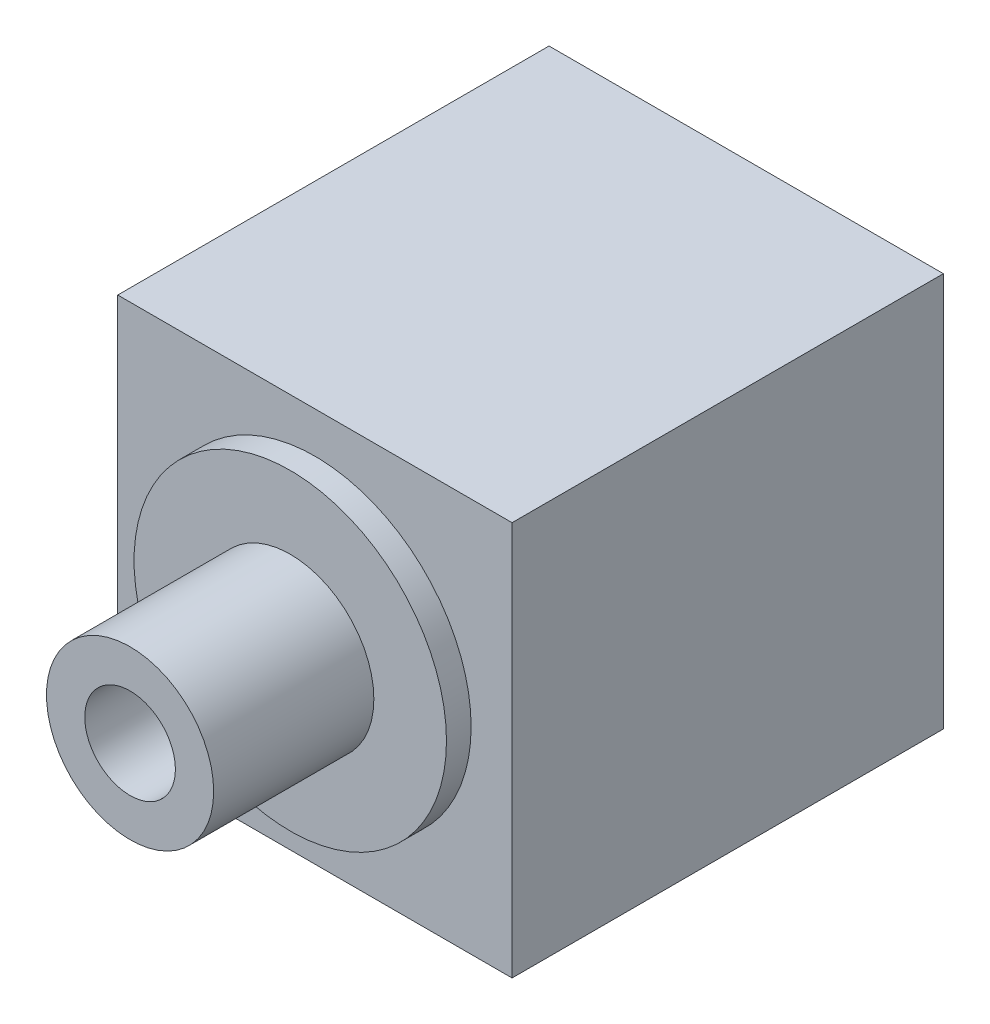
ISO-10303-21;
HEADER;
FILE_DESCRIPTION(('STEP AP214'),'2;1');
FILE_NAME('part.step','',(''),(''),'','','');
FILE_SCHEMA(('AUTOMOTIVE_DESIGN { 1 0 10303 214 1 1 1 1 }'));
ENDSEC;
DATA;
#1=APPLICATION_CONTEXT('core data for automotive mechanical design processes');
#2=APPLICATION_PROTOCOL_DEFINITION('international standard','automotive_design',2000,#1);
#3=PRODUCT_CONTEXT('',#1,'mechanical');
#4=PRODUCT('Part','Part','',(#3));
#5=PRODUCT_RELATED_PRODUCT_CATEGORY('part','',(#4));
#6=PRODUCT_DEFINITION_FORMATION('','',#4);
#7=PRODUCT_DEFINITION_CONTEXT('part definition',#1,'design');
#8=PRODUCT_DEFINITION('design','',#6,#7);
#9=PRODUCT_DEFINITION_SHAPE('','',#8);
#10=(LENGTH_UNIT() NAMED_UNIT(*) SI_UNIT(.MILLI.,.METRE.));
#11=(NAMED_UNIT(*) PLANE_ANGLE_UNIT() SI_UNIT($,.RADIAN.));
#12=(NAMED_UNIT(*) SI_UNIT($,.STERADIAN.) SOLID_ANGLE_UNIT());
#13=UNCERTAINTY_MEASURE_WITH_UNIT(LENGTH_MEASURE(1.E-05),#10,'distance_accuracy_value','');
#14=(GEOMETRIC_REPRESENTATION_CONTEXT(3) GLOBAL_UNCERTAINTY_ASSIGNED_CONTEXT((#13)) GLOBAL_UNIT_ASSIGNED_CONTEXT((#10,
#11,#12)) REPRESENTATION_CONTEXT('',''));
#15=CARTESIAN_POINT('',(0.,0.,0.));
#16=DIRECTION('',(0.,0.,1.));
#17=DIRECTION('',(1.,0.,0.));
#18=AXIS2_PLACEMENT_3D('',#15,#16,#17);
#19=CARTESIAN_POINT('',(-16.,16.,35.));
#20=DIRECTION('',(1.,0.,0.));
#21=DIRECTION('',(0.,1.,0.));
#22=AXIS2_PLACEMENT_3D('',#19,#20,#21);
#23=PLANE('',#22);
#24=DIRECTION('',(0.,-1.,0.));
#25=VECTOR('',#24,1.);
#26=CARTESIAN_POINT('',(-16.,16.,0.));
#27=LINE('',#26,#25);
#28=CARTESIAN_POINT('',(-16.,16.,0.));
#29=VERTEX_POINT('',#28);
#30=CARTESIAN_POINT('',(-16.,-16.,0.));
#31=VERTEX_POINT('',#30);
#32=EDGE_CURVE('E98',#29,#31,#27,.T.);
#33=ORIENTED_EDGE('',*,*,#32,.T.);
#34=DIRECTION('',(0.,0.,-1.));
#35=VECTOR('',#34,1.);
#36=CARTESIAN_POINT('',(-16.,-16.,35.));
#37=LINE('',#36,#35);
#38=CARTESIAN_POINT('',(-16.,-16.,35.));
#39=VERTEX_POINT('',#38);
#40=EDGE_CURVE('E40',#39,#31,#37,.T.);
#41=ORIENTED_EDGE('',*,*,#40,.F.);
#42=DIRECTION('',(0.,-1.,0.));
#43=VECTOR('',#42,1.);
#44=CARTESIAN_POINT('',(-16.,16.,35.));
#45=LINE('',#44,#43);
#46=CARTESIAN_POINT('',(-16.,16.,35.));
#47=VERTEX_POINT('',#46);
#48=EDGE_CURVE('E84',#47,#39,#45,.T.);
#49=ORIENTED_EDGE('',*,*,#48,.F.);
#50=DIRECTION('',(0.,0.,-1.));
#51=VECTOR('',#50,1.);
#52=CARTESIAN_POINT('',(-16.,16.,35.));
#53=LINE('',#52,#51);
#54=EDGE_CURVE('E94',#47,#29,#53,.T.);
#55=ORIENTED_EDGE('',*,*,#54,.T.);
#56=EDGE_LOOP('',(#33,#41,#49,#55));
#57=FACE_BOUND('',#56,.T.);
#58=ADVANCED_FACE('F32',(#57),#23,.F.);
#59=CARTESIAN_POINT('',(-16.,-16.,35.));
#60=DIRECTION('',(0.,1.,0.));
#61=DIRECTION('',(-1.,0.,0.));
#62=AXIS2_PLACEMENT_3D('',#59,#60,#61);
#63=PLANE('',#62);
#64=DIRECTION('',(1.,0.,0.));
#65=VECTOR('',#64,1.);
#66=CARTESIAN_POINT('',(-16.,-16.,0.));
#67=LINE('',#66,#65);
#68=CARTESIAN_POINT('',(16.,-16.,0.));
#69=VERTEX_POINT('',#68);
#70=EDGE_CURVE('E89',#31,#69,#67,.T.);
#71=ORIENTED_EDGE('',*,*,#70,.T.);
#72=DIRECTION('',(0.,0.,-1.));
#73=VECTOR('',#72,1.);
#74=CARTESIAN_POINT('',(16.,-16.,35.));
#75=LINE('',#74,#73);
#76=CARTESIAN_POINT('',(16.,-16.,35.));
#77=VERTEX_POINT('',#76);
#78=EDGE_CURVE('E87',#77,#69,#75,.T.);
#79=ORIENTED_EDGE('',*,*,#78,.F.);
#80=DIRECTION('',(1.,0.,0.));
#81=VECTOR('',#80,1.);
#82=CARTESIAN_POINT('',(-16.,-16.,35.));
#83=LINE('',#82,#81);
#84=EDGE_CURVE('E79',#39,#77,#83,.T.);
#85=ORIENTED_EDGE('',*,*,#84,.F.);
#86=ORIENTED_EDGE('',*,*,#40,.T.);
#87=EDGE_LOOP('',(#71,#79,#85,#86));
#88=FACE_BOUND('',#87,.T.);
#89=ADVANCED_FACE('F88',(#88),#63,.F.);
#90=CARTESIAN_POINT('',(16.,16.,35.));
#91=DIRECTION('',(-1.,0.,0.));
#92=DIRECTION('',(0.,-1.,0.));
#93=AXIS2_PLACEMENT_3D('',#90,#91,#92);
#94=PLANE('',#93);
#95=DIRECTION('',(0.,1.,0.));
#96=VECTOR('',#95,1.);
#97=CARTESIAN_POINT('',(16.,16.,0.));
#98=LINE('',#97,#96);
#99=CARTESIAN_POINT('',(16.,16.,0.));
#100=VERTEX_POINT('',#99);
#101=EDGE_CURVE('E65',#69,#100,#98,.T.);
#102=ORIENTED_EDGE('',*,*,#101,.T.);
#103=DIRECTION('',(0.,0.,-1.));
#104=VECTOR('',#103,1.);
#105=CARTESIAN_POINT('',(16.,16.,35.));
#106=LINE('',#105,#104);
#107=CARTESIAN_POINT('',(16.,16.,35.));
#108=VERTEX_POINT('',#107);
#109=EDGE_CURVE('E90',#108,#100,#106,.T.);
#110=ORIENTED_EDGE('',*,*,#109,.F.);
#111=DIRECTION('',(0.,1.,0.));
#112=VECTOR('',#111,1.);
#113=CARTESIAN_POINT('',(16.,16.,35.));
#114=LINE('',#113,#112);
#115=EDGE_CURVE('E82',#77,#108,#114,.T.);
#116=ORIENTED_EDGE('',*,*,#115,.F.);
#117=ORIENTED_EDGE('',*,*,#78,.T.);
#118=EDGE_LOOP('',(#102,#110,#116,#117));
#119=FACE_BOUND('',#118,.T.);
#120=ADVANCED_FACE('F92',(#119),#94,.F.);
#121=CARTESIAN_POINT('',(-16.,16.,35.));
#122=DIRECTION('',(0.,-1.,0.));
#123=DIRECTION('',(1.,0.,0.));
#124=AXIS2_PLACEMENT_3D('',#121,#122,#123);
#125=PLANE('',#124);
#126=DIRECTION('',(-1.,0.,0.));
#127=VECTOR('',#126,1.);
#128=CARTESIAN_POINT('',(-16.,16.,0.));
#129=LINE('',#128,#127);
#130=EDGE_CURVE('E71',#100,#29,#129,.T.);
#131=ORIENTED_EDGE('',*,*,#130,.T.);
#132=ORIENTED_EDGE('',*,*,#54,.F.);
#133=DIRECTION('',(-1.,0.,0.));
#134=VECTOR('',#133,1.);
#135=CARTESIAN_POINT('',(-16.,16.,35.));
#136=LINE('',#135,#134);
#137=EDGE_CURVE('E48',#108,#47,#136,.T.);
#138=ORIENTED_EDGE('',*,*,#137,.F.);
#139=ORIENTED_EDGE('',*,*,#109,.T.);
#140=EDGE_LOOP('',(#131,#132,#138,#139));
#141=FACE_BOUND('',#140,.T.);
#142=ADVANCED_FACE('F120',(#141),#125,.F.);
#143=CARTESIAN_POINT('',(0.,0.,35.));
#144=DIRECTION('',(0.,0.,1.));
#145=DIRECTION('',(1.,0.,0.));
#146=AXIS2_PLACEMENT_3D('',#143,#144,#145);
#147=PLANE('',#146);
#148=CARTESIAN_POINT('',(0.,0.,35.));
#149=DIRECTION('',(0.,0.,1.));
#150=DIRECTION('',(1.,0.,0.));
#151=AXIS2_PLACEMENT_3D('',#148,#149,#150);
#152=CIRCLE('',#151,12.6767261041116);
#153=CARTESIAN_POINT('',(12.6767261041116,0.,35.));
#154=VERTEX_POINT('',#153);
#155=EDGE_CURVE('E212',#154,#154,#152,.T.);
#156=ORIENTED_EDGE('',*,*,#155,.F.);
#157=EDGE_LOOP('',(#156));
#158=FACE_BOUND('',#157,.T.);
#159=ORIENTED_EDGE('',*,*,#48,.T.);
#160=ORIENTED_EDGE('',*,*,#84,.T.);
#161=ORIENTED_EDGE('',*,*,#115,.T.);
#162=ORIENTED_EDGE('',*,*,#137,.T.);
#163=EDGE_LOOP('',(#159,#160,#161,#162));
#164=FACE_BOUND('',#163,.T.);
#165=ADVANCED_FACE('F80',(#158,#164),#147,.T.);
#166=CARTESIAN_POINT('',(0.,0.,0.));
#167=DIRECTION('',(0.,0.,1.));
#168=DIRECTION('',(1.,0.,0.));
#169=AXIS2_PLACEMENT_3D('',#166,#167,#168);
#170=PLANE('',#169);
#171=ORIENTED_EDGE('',*,*,#32,.F.);
#172=ORIENTED_EDGE('',*,*,#130,.F.);
#173=ORIENTED_EDGE('',*,*,#101,.F.);
#174=ORIENTED_EDGE('',*,*,#70,.F.);
#175=EDGE_LOOP('',(#171,#172,#173,#174));
#176=FACE_BOUND('',#175,.T.);
#177=ADVANCED_FACE('F109',(#176),#170,.F.);
#178=CARTESIAN_POINT('',(0.,0.,37.));
#179=DIRECTION('',(0.,0.,-1.));
#180=DIRECTION('',(-1.,0.,0.));
#181=AXIS2_PLACEMENT_3D('',#178,#179,#180);
#182=CYLINDRICAL_SURFACE('',#181,12.6767261041116);
#183=CARTESIAN_POINT('',(0.,0.,37.));
#184=DIRECTION('',(0.,0.,1.));
#185=DIRECTION('',(1.,0.,0.));
#186=AXIS2_PLACEMENT_3D('',#183,#184,#185);
#187=CIRCLE('',#186,12.6767261041116);
#188=CARTESIAN_POINT('',(12.6767261041116,0.,37.));
#189=VERTEX_POINT('',#188);
#190=EDGE_CURVE('E209',#189,#189,#187,.T.);
#191=ORIENTED_EDGE('',*,*,#190,.F.);
#192=EDGE_LOOP('',(#191));
#193=FACE_BOUND('',#192,.T.);
#194=ORIENTED_EDGE('',*,*,#155,.T.);
#195=EDGE_LOOP('',(#194));
#196=FACE_BOUND('',#195,.T.);
#197=ADVANCED_FACE('F111',(#193,#196),#182,.T.);
#198=CARTESIAN_POINT('',(0.,0.,37.));
#199=DIRECTION('',(0.,0.,1.));
#200=DIRECTION('',(1.,0.,0.));
#201=AXIS2_PLACEMENT_3D('',#198,#199,#200);
#202=PLANE('',#201);
#203=CARTESIAN_POINT('',(0.,0.,37.));
#204=DIRECTION('',(0.,0.,1.));
#205=DIRECTION('',(1.,0.,0.));
#206=AXIS2_PLACEMENT_3D('',#203,#204,#205);
#207=CIRCLE('',#206,6.78402957500107);
#208=CARTESIAN_POINT('',(6.78402957500107,0.,37.));
#209=VERTEX_POINT('',#208);
#210=EDGE_CURVE('E205',#209,#209,#207,.T.);
#211=ORIENTED_EDGE('',*,*,#210,.F.);
#212=EDGE_LOOP('',(#211));
#213=FACE_BOUND('',#212,.T.);
#214=ORIENTED_EDGE('',*,*,#190,.T.);
#215=EDGE_LOOP('',(#214));
#216=FACE_BOUND('',#215,.T.);
#217=ADVANCED_FACE('F117',(#213,#216),#202,.T.);
#218=CARTESIAN_POINT('',(0.,0.,50.));
#219=DIRECTION('',(0.,0.,-1.));
#220=DIRECTION('',(-1.,0.,0.));
#221=AXIS2_PLACEMENT_3D('',#218,#219,#220);
#222=CYLINDRICAL_SURFACE('',#221,6.78402957500107);
#223=ORIENTED_EDGE('',*,*,#210,.T.);
#224=EDGE_LOOP('',(#223));
#225=FACE_BOUND('',#224,.T.);
#226=CARTESIAN_POINT('',(0.,0.,50.));
#227=DIRECTION('',(0.,0.,1.));
#228=DIRECTION('',(1.,0.,0.));
#229=AXIS2_PLACEMENT_3D('',#226,#227,#228);
#230=CIRCLE('',#229,6.78402957500107);
#231=CARTESIAN_POINT('',(6.78402957500107,0.,50.));
#232=VERTEX_POINT('',#231);
#233=EDGE_CURVE('E101',#232,#232,#230,.T.);
#234=ORIENTED_EDGE('',*,*,#233,.F.);
#235=EDGE_LOOP('',(#234));
#236=FACE_BOUND('',#235,.T.);
#237=ADVANCED_FACE('F163',(#225,#236),#222,.T.);
#238=CARTESIAN_POINT('',(0.,0.,50.));
#239=DIRECTION('',(0.,0.,1.));
#240=DIRECTION('',(1.,0.,0.));
#241=AXIS2_PLACEMENT_3D('',#238,#239,#240);
#242=PLANE('',#241);
#243=ORIENTED_EDGE('',*,*,#233,.T.);
#244=EDGE_LOOP('',(#243));
#245=FACE_BOUND('',#244,.T.);
#246=CARTESIAN_POINT('',(0.,0.,50.));
#247=DIRECTION('',(0.,0.,1.));
#248=DIRECTION('',(1.,0.,0.));
#249=AXIS2_PLACEMENT_3D('',#246,#247,#248);
#250=CIRCLE('',#249,3.67793774590904);
#251=CARTESIAN_POINT('',(3.67793774590904,0.,50.));
#252=VERTEX_POINT('',#251);
#253=EDGE_CURVE('E203',#252,#252,#250,.T.);
#254=ORIENTED_EDGE('',*,*,#253,.F.);
#255=EDGE_LOOP('',(#254));
#256=FACE_BOUND('',#255,.T.);
#257=ADVANCED_FACE('F148',(#245,#256),#242,.T.);
#258=CARTESIAN_POINT('',(0.,0.,50.));
#259=DIRECTION('',(0.,0.,-1.));
#260=DIRECTION('',(-1.,0.,0.));
#261=AXIS2_PLACEMENT_3D('',#258,#259,#260);
#262=CYLINDRICAL_SURFACE('',#261,3.67793774590904);
#263=CARTESIAN_POINT('',(0.,0.,37.));
#264=DIRECTION('',(0.,0.,1.));
#265=DIRECTION('',(1.,0.,0.));
#266=AXIS2_PLACEMENT_3D('',#263,#264,#265);
#267=CIRCLE('',#266,3.67793774590904);
#268=CARTESIAN_POINT('',(3.67793774590904,0.,37.));
#269=VERTEX_POINT('',#268);
#270=EDGE_CURVE('E11',#269,#269,#267,.T.);
#271=ORIENTED_EDGE('',*,*,#270,.F.);
#272=EDGE_LOOP('',(#271));
#273=FACE_BOUND('',#272,.T.);
#274=ORIENTED_EDGE('',*,*,#253,.T.);
#275=EDGE_LOOP('',(#274));
#276=FACE_BOUND('',#275,.T.);
#277=ADVANCED_FACE('F180',(#273,#276),#262,.F.);
#278=ORIENTED_EDGE('',*,*,#270,.T.);
#279=EDGE_LOOP('',(#278));
#280=FACE_BOUND('',#279,.T.);
#281=ADVANCED_FACE('F166',(#280),#202,.T.);
#282=CLOSED_SHELL('',(#58,#89,#120,#142,#165,#177,#197,#217,#237,#257,#277,#281));
#283=MANIFOLD_SOLID_BREP('B2',#282);
#284=ADVANCED_BREP_SHAPE_REPRESENTATION('',(#18,#283),#14);
#285=SHAPE_DEFINITION_REPRESENTATION(#9,#284);
ENDSEC;
END-ISO-10303-21;
